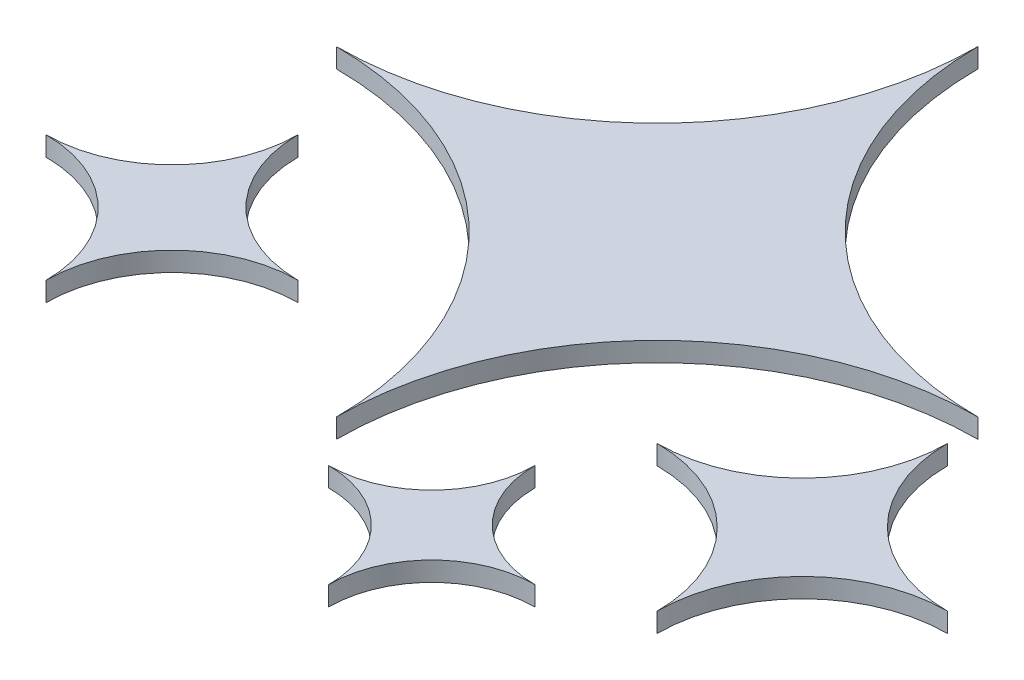
ISO-10303-21;
HEADER;
FILE_DESCRIPTION(('STEP AP214'),'2;1');
FILE_NAME('part.step','',(''),(''),'','','');
FILE_SCHEMA(('AUTOMOTIVE_DESIGN { 1 0 10303 214 1 1 1 1 }'));
ENDSEC;
DATA;
#1=APPLICATION_CONTEXT('core data for automotive mechanical design processes');
#2=APPLICATION_PROTOCOL_DEFINITION('international standard','automotive_design',2000,#1);
#3=PRODUCT_CONTEXT('',#1,'mechanical');
#4=PRODUCT('Part','Part','',(#3));
#5=PRODUCT_RELATED_PRODUCT_CATEGORY('part','',(#4));
#6=PRODUCT_DEFINITION_FORMATION('','',#4);
#7=PRODUCT_DEFINITION_CONTEXT('part definition',#1,'design');
#8=PRODUCT_DEFINITION('design','',#6,#7);
#9=PRODUCT_DEFINITION_SHAPE('','',#8);
#10=(LENGTH_UNIT() NAMED_UNIT(*) SI_UNIT(.MILLI.,.METRE.));
#11=(NAMED_UNIT(*) PLANE_ANGLE_UNIT() SI_UNIT($,.RADIAN.));
#12=(NAMED_UNIT(*) SI_UNIT($,.STERADIAN.) SOLID_ANGLE_UNIT());
#13=UNCERTAINTY_MEASURE_WITH_UNIT(LENGTH_MEASURE(1.E-05),#10,'distance_accuracy_value','');
#14=(GEOMETRIC_REPRESENTATION_CONTEXT(3) GLOBAL_UNCERTAINTY_ASSIGNED_CONTEXT((#13)) GLOBAL_UNIT_ASSIGNED_CONTEXT((#10,
#11,#12)) REPRESENTATION_CONTEXT('',''));
#15=CARTESIAN_POINT('',(0.,0.,0.));
#16=DIRECTION('',(0.,0.,1.));
#17=DIRECTION('',(1.,0.,0.));
#18=AXIS2_PLACEMENT_3D('',#15,#16,#17);
#19=CARTESIAN_POINT('',(49.0000084881791,2.54,-59.0000004293108));
#20=DIRECTION('',(0.,-1.,0.));
#21=DIRECTION('',(0.,0.,-1.));
#22=AXIS2_PLACEMENT_3D('',#19,#20,#21);
#23=CYLINDRICAL_SURFACE('',#22,16.5000025969945);
#24=CARTESIAN_POINT('',(49.0000084881791,0.,-59.0000004293108));
#25=DIRECTION('',(0.,-1.,0.));
#26=DIRECTION('',(0.,0.,1.));
#27=AXIS2_PLACEMENT_3D('',#24,#25,#26);
#28=CIRCLE('',#27,16.5000025969945);
#29=CARTESIAN_POINT('',(49.0000084881791,0.,-42.4999978323163));
#30=VERTEX_POINT('',#29);
#31=CARTESIAN_POINT('',(32.5000058911847,0.,-59.0000004293108));
#32=VERTEX_POINT('',#31);
#33=EDGE_CURVE('E12',#30,#32,#28,.T.);
#34=ORIENTED_EDGE('',*,*,#33,.T.);
#35=DIRECTION('',(0.,-1.,0.));
#36=VECTOR('',#35,1.);
#37=CARTESIAN_POINT('',(32.5000058911847,2.54,-59.0000004293108));
#38=LINE('',#37,#36);
#39=CARTESIAN_POINT('',(32.5000058911847,2.54,-59.0000004293108));
#40=VERTEX_POINT('',#39);
#41=EDGE_CURVE('E124',#40,#32,#38,.T.);
#42=ORIENTED_EDGE('',*,*,#41,.F.);
#43=CARTESIAN_POINT('',(49.0000084881791,2.54,-59.0000004293108));
#44=DIRECTION('',(0.,-1.,0.));
#45=DIRECTION('',(0.,0.,1.));
#46=AXIS2_PLACEMENT_3D('',#43,#44,#45);
#47=CIRCLE('',#46,16.5000025969945);
#48=CARTESIAN_POINT('',(49.0000084881791,2.54,-42.4999978323163));
#49=VERTEX_POINT('',#48);
#50=EDGE_CURVE('E57',#49,#40,#47,.T.);
#51=ORIENTED_EDGE('',*,*,#50,.F.);
#52=DIRECTION('',(0.,-1.,0.));
#53=VECTOR('',#52,1.);
#54=CARTESIAN_POINT('',(49.0000084881791,2.54,-42.4999978323163));
#55=LINE('',#54,#53);
#56=EDGE_CURVE('E112',#49,#30,#55,.T.);
#57=ORIENTED_EDGE('',*,*,#56,.T.);
#58=EDGE_LOOP('',(#34,#42,#51,#57));
#59=FACE_BOUND('',#58,.T.);
#60=ADVANCED_FACE('F53',(#59),#23,.F.);
#61=CARTESIAN_POINT('',(16.0000032941902,2.54,-59.0000004293108));
#62=DIRECTION('',(0.,-1.,0.));
#63=DIRECTION('',(0.,0.,-1.));
#64=AXIS2_PLACEMENT_3D('',#61,#62,#63);
#65=CYLINDRICAL_SURFACE('',#64,16.5000025969945);
#66=CARTESIAN_POINT('',(16.0000032941902,0.,-59.0000004293108));
#67=DIRECTION('',(0.,-1.,0.));
#68=DIRECTION('',(0.,0.,-1.));
#69=AXIS2_PLACEMENT_3D('',#66,#67,#68);
#70=CIRCLE('',#69,16.5000025969945);
#71=CARTESIAN_POINT('',(16.0000032941902,0.,-42.4999978323163));
#72=VERTEX_POINT('',#71);
#73=EDGE_CURVE('E63',#32,#72,#70,.T.);
#74=ORIENTED_EDGE('',*,*,#73,.T.);
#75=DIRECTION('',(0.,-1.,0.));
#76=VECTOR('',#75,1.);
#77=CARTESIAN_POINT('',(16.0000032941902,2.54,-42.4999978323163));
#78=LINE('',#77,#76);
#79=CARTESIAN_POINT('',(16.0000032941902,2.54,-42.4999978323163));
#80=VERTEX_POINT('',#79);
#81=EDGE_CURVE('E108',#80,#72,#78,.T.);
#82=ORIENTED_EDGE('',*,*,#81,.F.);
#83=CARTESIAN_POINT('',(16.0000032941902,2.54,-59.0000004293108));
#84=DIRECTION('',(0.,-1.,0.));
#85=DIRECTION('',(0.,0.,-1.));
#86=AXIS2_PLACEMENT_3D('',#83,#84,#85);
#87=CIRCLE('',#86,16.5000025969945);
#88=EDGE_CURVE('E87',#40,#80,#87,.T.);
#89=ORIENTED_EDGE('',*,*,#88,.F.);
#90=ORIENTED_EDGE('',*,*,#41,.T.);
#91=EDGE_LOOP('',(#74,#82,#89,#90));
#92=FACE_BOUND('',#91,.T.);
#93=ADVANCED_FACE('F127',(#92),#65,.F.);
#94=CARTESIAN_POINT('',(16.0000032941902,2.54,-25.9999952353219));
#95=DIRECTION('',(0.,-1.,0.));
#96=DIRECTION('',(0.,0.,-1.));
#97=AXIS2_PLACEMENT_3D('',#94,#95,#96);
#98=CYLINDRICAL_SURFACE('',#97,16.5000025969944);
#99=CARTESIAN_POINT('',(16.0000032941902,0.,-25.9999952353219));
#100=DIRECTION('',(0.,-1.,0.));
#101=DIRECTION('',(0.,0.,1.));
#102=AXIS2_PLACEMENT_3D('',#99,#100,#101);
#103=CIRCLE('',#102,16.5000025969944);
#104=CARTESIAN_POINT('',(32.5000058911847,0.,-25.9999952353219));
#105=VERTEX_POINT('',#104);
#106=EDGE_CURVE('E103',#72,#105,#103,.T.);
#107=ORIENTED_EDGE('',*,*,#106,.T.);
#108=DIRECTION('',(0.,-1.,0.));
#109=VECTOR('',#108,1.);
#110=CARTESIAN_POINT('',(32.5000058911847,2.54,-25.9999952353219));
#111=LINE('',#110,#109);
#112=CARTESIAN_POINT('',(32.5000058911847,2.54,-25.9999952353219));
#113=VERTEX_POINT('',#112);
#114=EDGE_CURVE('E106',#113,#105,#111,.T.);
#115=ORIENTED_EDGE('',*,*,#114,.F.);
#116=CARTESIAN_POINT('',(16.0000032941902,2.54,-25.9999952353219));
#117=DIRECTION('',(0.,-1.,0.));
#118=DIRECTION('',(0.,0.,1.));
#119=AXIS2_PLACEMENT_3D('',#116,#117,#118);
#120=CIRCLE('',#119,16.5000025969944);
#121=EDGE_CURVE('E120',#80,#113,#120,.T.);
#122=ORIENTED_EDGE('',*,*,#121,.F.);
#123=ORIENTED_EDGE('',*,*,#81,.T.);
#124=EDGE_LOOP('',(#107,#115,#122,#123));
#125=FACE_BOUND('',#124,.T.);
#126=ADVANCED_FACE('F104',(#125),#98,.F.);
#127=CARTESIAN_POINT('',(49.0000084881791,2.54,-25.9999952353219));
#128=DIRECTION('',(0.,-1.,0.));
#129=DIRECTION('',(0.,0.,-1.));
#130=AXIS2_PLACEMENT_3D('',#127,#128,#129);
#131=CYLINDRICAL_SURFACE('',#130,16.5000025969945);
#132=CARTESIAN_POINT('',(49.0000084881791,0.,-25.9999952353219));
#133=DIRECTION('',(0.,-1.,0.));
#134=DIRECTION('',(0.,0.,-1.));
#135=AXIS2_PLACEMENT_3D('',#132,#133,#134);
#136=CIRCLE('',#135,16.5000025969945);
#137=EDGE_CURVE('E97',#105,#30,#136,.T.);
#138=ORIENTED_EDGE('',*,*,#137,.T.);
#139=ORIENTED_EDGE('',*,*,#56,.F.);
#140=CARTESIAN_POINT('',(49.0000084881791,2.54,-25.9999952353219));
#141=DIRECTION('',(0.,-1.,0.));
#142=DIRECTION('',(0.,0.,-1.));
#143=AXIS2_PLACEMENT_3D('',#140,#141,#142);
#144=CIRCLE('',#143,16.5000025969945);
#145=EDGE_CURVE('E111',#113,#49,#144,.T.);
#146=ORIENTED_EDGE('',*,*,#145,.F.);
#147=ORIENTED_EDGE('',*,*,#114,.T.);
#148=EDGE_LOOP('',(#138,#139,#146,#147));
#149=FACE_BOUND('',#148,.T.);
#150=ADVANCED_FACE('F110',(#149),#131,.F.);
#151=CARTESIAN_POINT('',(49.0000084881791,2.54,-42.4999978323163));
#152=DIRECTION('',(0.,1.,0.));
#153=DIRECTION('',(0.,0.,1.));
#154=AXIS2_PLACEMENT_3D('',#151,#152,#153);
#155=PLANE('',#154);
#156=ORIENTED_EDGE('',*,*,#50,.T.);
#157=ORIENTED_EDGE('',*,*,#88,.T.);
#158=ORIENTED_EDGE('',*,*,#121,.T.);
#159=ORIENTED_EDGE('',*,*,#145,.T.);
#160=EDGE_LOOP('',(#156,#157,#158,#159));
#161=FACE_BOUND('',#160,.T.);
#162=ADVANCED_FACE('F55',(#161),#155,.T.);
#163=CARTESIAN_POINT('',(49.0000084881791,0.,-42.4999978323163));
#164=DIRECTION('',(0.,1.,0.));
#165=DIRECTION('',(0.,0.,1.));
#166=AXIS2_PLACEMENT_3D('',#163,#164,#165);
#167=PLANE('',#166);
#168=ORIENTED_EDGE('',*,*,#33,.F.);
#169=ORIENTED_EDGE('',*,*,#137,.F.);
#170=ORIENTED_EDGE('',*,*,#106,.F.);
#171=ORIENTED_EDGE('',*,*,#73,.F.);
#172=EDGE_LOOP('',(#168,#169,#170,#171));
#173=FACE_BOUND('',#172,.T.);
#174=ADVANCED_FACE('F114',(#173),#167,.F.);
#175=CLOSED_SHELL('',(#60,#93,#126,#150,#162,#174));
#176=MANIFOLD_SOLID_BREP('B2',#175);
#177=CARTESIAN_POINT('',(99.000008693278,2.54,-37.0000076373067));
#178=DIRECTION('',(0.,-1.,0.));
#179=DIRECTION('',(0.,0.,-1.));
#180=AXIS2_PLACEMENT_3D('',#177,#178,#179);
#181=CYLINDRICAL_SURFACE('',#180,13.50000653279);
#182=CARTESIAN_POINT('',(99.000008693278,0.,-37.0000076373067));
#183=DIRECTION('',(0.,-1.,0.));
#184=DIRECTION('',(0.,0.,1.));
#185=AXIS2_PLACEMENT_3D('',#182,#183,#184);
#186=CIRCLE('',#185,13.50000653279);
#187=CARTESIAN_POINT('',(99.000008693278,0.,-23.5000011045167));
#188=VERTEX_POINT('',#187);
#189=CARTESIAN_POINT('',(85.5000021604879,0.,-37.0000076373067));
#190=VERTEX_POINT('',#189);
#191=EDGE_CURVE('E51',#188,#190,#186,.T.);
#192=ORIENTED_EDGE('',*,*,#191,.T.);
#193=DIRECTION('',(0.,-1.,0.));
#194=VECTOR('',#193,1.);
#195=CARTESIAN_POINT('',(85.5000021604879,2.54,-37.0000076373067));
#196=LINE('',#195,#194);
#197=CARTESIAN_POINT('',(85.5000021604879,2.54,-37.0000076373067));
#198=VERTEX_POINT('',#197);
#199=EDGE_CURVE('E269',#198,#190,#196,.T.);
#200=ORIENTED_EDGE('',*,*,#199,.F.);
#201=CARTESIAN_POINT('',(99.000008693278,2.54,-37.0000076373067));
#202=DIRECTION('',(0.,-1.,0.));
#203=DIRECTION('',(0.,0.,1.));
#204=AXIS2_PLACEMENT_3D('',#201,#202,#203);
#205=CIRCLE('',#204,13.50000653279);
#206=CARTESIAN_POINT('',(99.000008693278,2.54,-23.5000011045167));
#207=VERTEX_POINT('',#206);
#208=EDGE_CURVE('E202',#207,#198,#205,.T.);
#209=ORIENTED_EDGE('',*,*,#208,.F.);
#210=DIRECTION('',(0.,-1.,0.));
#211=VECTOR('',#210,1.);
#212=CARTESIAN_POINT('',(99.000008693278,2.54,-23.5000011045167));
#213=LINE('',#212,#211);
#214=EDGE_CURVE('E257',#207,#188,#213,.T.);
#215=ORIENTED_EDGE('',*,*,#214,.T.);
#216=EDGE_LOOP('',(#192,#200,#209,#215));
#217=FACE_BOUND('',#216,.T.);
#218=ADVANCED_FACE('F198',(#217),#181,.F.);
#219=CARTESIAN_POINT('',(71.9999956276979,2.54,-37.0000076373067));
#220=DIRECTION('',(0.,-1.,0.));
#221=DIRECTION('',(0.,0.,-1.));
#222=AXIS2_PLACEMENT_3D('',#219,#220,#221);
#223=CYLINDRICAL_SURFACE('',#222,13.50000653279);
#224=CARTESIAN_POINT('',(71.9999956276979,0.,-37.0000076373067));
#225=DIRECTION('',(0.,-1.,0.));
#226=DIRECTION('',(0.,0.,-1.));
#227=AXIS2_PLACEMENT_3D('',#224,#225,#226);
#228=CIRCLE('',#227,13.50000653279);
#229=CARTESIAN_POINT('',(71.9999956276979,0.,-23.5000011045167));
#230=VERTEX_POINT('',#229);
#231=EDGE_CURVE('E208',#190,#230,#228,.T.);
#232=ORIENTED_EDGE('',*,*,#231,.T.);
#233=DIRECTION('',(0.,-1.,0.));
#234=VECTOR('',#233,1.);
#235=CARTESIAN_POINT('',(71.9999956276979,2.54,-23.5000011045167));
#236=LINE('',#235,#234);
#237=CARTESIAN_POINT('',(71.9999956276979,2.54,-23.5000011045167));
#238=VERTEX_POINT('',#237);
#239=EDGE_CURVE('E253',#238,#230,#236,.T.);
#240=ORIENTED_EDGE('',*,*,#239,.F.);
#241=CARTESIAN_POINT('',(71.9999956276979,2.54,-37.0000076373067));
#242=DIRECTION('',(0.,-1.,0.));
#243=DIRECTION('',(0.,0.,-1.));
#244=AXIS2_PLACEMENT_3D('',#241,#242,#243);
#245=CIRCLE('',#244,13.50000653279);
#246=EDGE_CURVE('E232',#198,#238,#245,.T.);
#247=ORIENTED_EDGE('',*,*,#246,.F.);
#248=ORIENTED_EDGE('',*,*,#199,.T.);
#249=EDGE_LOOP('',(#232,#240,#247,#248));
#250=FACE_BOUND('',#249,.T.);
#251=ADVANCED_FACE('F272',(#250),#223,.F.);
#252=CARTESIAN_POINT('',(71.9999956276979,2.54,-9.99999457172668));
#253=DIRECTION('',(0.,-1.,0.));
#254=DIRECTION('',(0.,0.,-1.));
#255=AXIS2_PLACEMENT_3D('',#252,#253,#254);
#256=CYLINDRICAL_SURFACE('',#255,13.50000653279);
#257=CARTESIAN_POINT('',(71.9999956276979,0.,-9.99999457172668));
#258=DIRECTION('',(0.,-1.,0.));
#259=DIRECTION('',(0.,0.,1.));
#260=AXIS2_PLACEMENT_3D('',#257,#258,#259);
#261=CIRCLE('',#260,13.50000653279);
#262=CARTESIAN_POINT('',(85.5000021604879,0.,-9.99999457172665));
#263=VERTEX_POINT('',#262);
#264=EDGE_CURVE('E248',#230,#263,#261,.T.);
#265=ORIENTED_EDGE('',*,*,#264,.T.);
#266=DIRECTION('',(0.,-1.,0.));
#267=VECTOR('',#266,1.);
#268=CARTESIAN_POINT('',(85.5000021604879,2.54,-9.99999457172665));
#269=LINE('',#268,#267);
#270=CARTESIAN_POINT('',(85.5000021604879,2.54,-9.99999457172665));
#271=VERTEX_POINT('',#270);
#272=EDGE_CURVE('E251',#271,#263,#269,.T.);
#273=ORIENTED_EDGE('',*,*,#272,.F.);
#274=CARTESIAN_POINT('',(71.9999956276979,2.54,-9.99999457172668));
#275=DIRECTION('',(0.,-1.,0.));
#276=DIRECTION('',(0.,0.,1.));
#277=AXIS2_PLACEMENT_3D('',#274,#275,#276);
#278=CIRCLE('',#277,13.50000653279);
#279=EDGE_CURVE('E265',#238,#271,#278,.T.);
#280=ORIENTED_EDGE('',*,*,#279,.F.);
#281=ORIENTED_EDGE('',*,*,#239,.T.);
#282=EDGE_LOOP('',(#265,#273,#280,#281));
#283=FACE_BOUND('',#282,.T.);
#284=ADVANCED_FACE('F249',(#283),#256,.F.);
#285=CARTESIAN_POINT('',(99.000008693278,2.54,-9.99999457172665));
#286=DIRECTION('',(0.,-1.,0.));
#287=DIRECTION('',(0.,0.,-1.));
#288=AXIS2_PLACEMENT_3D('',#285,#286,#287);
#289=CYLINDRICAL_SURFACE('',#288,13.50000653279);
#290=CARTESIAN_POINT('',(99.000008693278,0.,-9.99999457172665));
#291=DIRECTION('',(0.,-1.,0.));
#292=DIRECTION('',(0.,0.,-1.));
#293=AXIS2_PLACEMENT_3D('',#290,#291,#292);
#294=CIRCLE('',#293,13.50000653279);
#295=EDGE_CURVE('E242',#263,#188,#294,.T.);
#296=ORIENTED_EDGE('',*,*,#295,.T.);
#297=ORIENTED_EDGE('',*,*,#214,.F.);
#298=CARTESIAN_POINT('',(99.000008693278,2.54,-9.99999457172665));
#299=DIRECTION('',(0.,-1.,0.));
#300=DIRECTION('',(0.,0.,-1.));
#301=AXIS2_PLACEMENT_3D('',#298,#299,#300);
#302=CIRCLE('',#301,13.50000653279);
#303=EDGE_CURVE('E256',#271,#207,#302,.T.);
#304=ORIENTED_EDGE('',*,*,#303,.F.);
#305=ORIENTED_EDGE('',*,*,#272,.T.);
#306=EDGE_LOOP('',(#296,#297,#304,#305));
#307=FACE_BOUND('',#306,.T.);
#308=ADVANCED_FACE('F255',(#307),#289,.F.);
#309=CARTESIAN_POINT('',(99.000008693278,2.54,-23.5000011045167));
#310=DIRECTION('',(0.,1.,0.));
#311=DIRECTION('',(0.,0.,1.));
#312=AXIS2_PLACEMENT_3D('',#309,#310,#311);
#313=PLANE('',#312);
#314=ORIENTED_EDGE('',*,*,#208,.T.);
#315=ORIENTED_EDGE('',*,*,#246,.T.);
#316=ORIENTED_EDGE('',*,*,#279,.T.);
#317=ORIENTED_EDGE('',*,*,#303,.T.);
#318=EDGE_LOOP('',(#314,#315,#316,#317));
#319=FACE_BOUND('',#318,.T.);
#320=ADVANCED_FACE('F200',(#319),#313,.T.);
#321=CARTESIAN_POINT('',(99.000008693278,0.,-23.5000011045167));
#322=DIRECTION('',(0.,1.,0.));
#323=DIRECTION('',(0.,0.,1.));
#324=AXIS2_PLACEMENT_3D('',#321,#322,#323);
#325=PLANE('',#324);
#326=ORIENTED_EDGE('',*,*,#191,.F.);
#327=ORIENTED_EDGE('',*,*,#295,.F.);
#328=ORIENTED_EDGE('',*,*,#264,.F.);
#329=ORIENTED_EDGE('',*,*,#231,.F.);
#330=EDGE_LOOP('',(#326,#327,#328,#329));
#331=FACE_BOUND('',#330,.T.);
#332=ADVANCED_FACE('F259',(#331),#325,.F.);
#333=CLOSED_SHELL('',(#218,#251,#284,#308,#320,#332));
#334=MANIFOLD_SOLID_BREP('B6',#333);
#335=CARTESIAN_POINT('',(129.000016704429,2.54,-66.500014723013));
#336=DIRECTION('',(0.,-1.,0.));
#337=DIRECTION('',(0.,0.,-1.));
#338=AXIS2_PLACEMENT_3D('',#335,#336,#337);
#339=CYLINDRICAL_SURFACE('',#338,19.0000095513192);
#340=CARTESIAN_POINT('',(129.000016704429,0.,-66.500014723013));
#341=DIRECTION('',(0.,-1.,0.));
#342=DIRECTION('',(0.,0.,1.));
#343=AXIS2_PLACEMENT_3D('',#340,#341,#342);
#344=CIRCLE('',#343,19.0000095513192);
#345=CARTESIAN_POINT('',(129.000016704429,0.,-47.5000051716939));
#346=VERTEX_POINT('',#345);
#347=CARTESIAN_POINT('',(110.000007153109,0.,-66.500014723013));
#348=VERTEX_POINT('',#347);
#349=EDGE_CURVE('E196',#346,#348,#344,.T.);
#350=ORIENTED_EDGE('',*,*,#349,.T.);
#351=DIRECTION('',(0.,-1.,0.));
#352=VECTOR('',#351,1.);
#353=CARTESIAN_POINT('',(110.000007153109,2.54,-66.500014723013));
#354=LINE('',#353,#352);
#355=CARTESIAN_POINT('',(110.000007153109,2.54,-66.500014723013));
#356=VERTEX_POINT('',#355);
#357=EDGE_CURVE('E413',#356,#348,#354,.T.);
#358=ORIENTED_EDGE('',*,*,#357,.F.);
#359=CARTESIAN_POINT('',(129.000016704429,2.54,-66.500014723013));
#360=DIRECTION('',(0.,-1.,0.));
#361=DIRECTION('',(0.,0.,1.));
#362=AXIS2_PLACEMENT_3D('',#359,#360,#361);
#363=CIRCLE('',#362,19.0000095513192);
#364=CARTESIAN_POINT('',(129.000016704429,2.54,-47.5000051716939));
#365=VERTEX_POINT('',#364);
#366=EDGE_CURVE('E346',#365,#356,#363,.T.);
#367=ORIENTED_EDGE('',*,*,#366,.F.);
#368=DIRECTION('',(0.,-1.,0.));
#369=VECTOR('',#368,1.);
#370=CARTESIAN_POINT('',(129.000016704429,2.54,-47.5000051716939));
#371=LINE('',#370,#369);
#372=EDGE_CURVE('E401',#365,#346,#371,.T.);
#373=ORIENTED_EDGE('',*,*,#372,.T.);
#374=EDGE_LOOP('',(#350,#358,#367,#373));
#375=FACE_BOUND('',#374,.T.);
#376=ADVANCED_FACE('F342',(#375),#339,.F.);
#377=CARTESIAN_POINT('',(90.9999976017903,2.54,-66.500014723013));
#378=DIRECTION('',(0.,-1.,0.));
#379=DIRECTION('',(0.,0.,-1.));
#380=AXIS2_PLACEMENT_3D('',#377,#378,#379);
#381=CYLINDRICAL_SURFACE('',#380,19.0000095513192);
#382=CARTESIAN_POINT('',(90.9999976017903,0.,-66.500014723013));
#383=DIRECTION('',(0.,-1.,0.));
#384=DIRECTION('',(0.,0.,-1.));
#385=AXIS2_PLACEMENT_3D('',#382,#383,#384);
#386=CIRCLE('',#385,19.0000095513192);
#387=CARTESIAN_POINT('',(90.9999976017903,0.,-47.5000051716939));
#388=VERTEX_POINT('',#387);
#389=EDGE_CURVE('E352',#348,#388,#386,.T.);
#390=ORIENTED_EDGE('',*,*,#389,.T.);
#391=DIRECTION('',(0.,-1.,0.));
#392=VECTOR('',#391,1.);
#393=CARTESIAN_POINT('',(90.9999976017903,2.54,-47.5000051716939));
#394=LINE('',#393,#392);
#395=CARTESIAN_POINT('',(90.9999976017903,2.54,-47.5000051716939));
#396=VERTEX_POINT('',#395);
#397=EDGE_CURVE('E397',#396,#388,#394,.T.);
#398=ORIENTED_EDGE('',*,*,#397,.F.);
#399=CARTESIAN_POINT('',(90.9999976017903,2.54,-66.500014723013));
#400=DIRECTION('',(0.,-1.,0.));
#401=DIRECTION('',(0.,0.,-1.));
#402=AXIS2_PLACEMENT_3D('',#399,#400,#401);
#403=CIRCLE('',#402,19.0000095513192);
#404=EDGE_CURVE('E376',#356,#396,#403,.T.);
#405=ORIENTED_EDGE('',*,*,#404,.F.);
#406=ORIENTED_EDGE('',*,*,#357,.T.);
#407=EDGE_LOOP('',(#390,#398,#405,#406));
#408=FACE_BOUND('',#407,.T.);
#409=ADVANCED_FACE('F416',(#408),#381,.F.);
#410=CARTESIAN_POINT('',(90.9999976017903,2.54,-28.4999956203747));
#411=DIRECTION('',(0.,-1.,0.));
#412=DIRECTION('',(0.,0.,-1.));
#413=AXIS2_PLACEMENT_3D('',#410,#411,#412);
#414=CYLINDRICAL_SURFACE('',#413,19.0000095513192);
#415=CARTESIAN_POINT('',(90.9999976017903,0.,-28.4999956203747));
#416=DIRECTION('',(0.,-1.,0.));
#417=DIRECTION('',(0.,0.,1.));
#418=AXIS2_PLACEMENT_3D('',#415,#416,#417);
#419=CIRCLE('',#418,19.0000095513192);
#420=CARTESIAN_POINT('',(110.000007153109,0.,-28.4999956203747));
#421=VERTEX_POINT('',#420);
#422=EDGE_CURVE('E392',#388,#421,#419,.T.);
#423=ORIENTED_EDGE('',*,*,#422,.T.);
#424=DIRECTION('',(0.,-1.,0.));
#425=VECTOR('',#424,1.);
#426=CARTESIAN_POINT('',(110.000007153109,2.54,-28.4999956203747));
#427=LINE('',#426,#425);
#428=CARTESIAN_POINT('',(110.000007153109,2.54,-28.4999956203747));
#429=VERTEX_POINT('',#428);
#430=EDGE_CURVE('E395',#429,#421,#427,.T.);
#431=ORIENTED_EDGE('',*,*,#430,.F.);
#432=CARTESIAN_POINT('',(90.9999976017903,2.54,-28.4999956203747));
#433=DIRECTION('',(0.,-1.,0.));
#434=DIRECTION('',(0.,0.,1.));
#435=AXIS2_PLACEMENT_3D('',#432,#433,#434);
#436=CIRCLE('',#435,19.0000095513192);
#437=EDGE_CURVE('E409',#396,#429,#436,.T.);
#438=ORIENTED_EDGE('',*,*,#437,.F.);
#439=ORIENTED_EDGE('',*,*,#397,.T.);
#440=EDGE_LOOP('',(#423,#431,#438,#439));
#441=FACE_BOUND('',#440,.T.);
#442=ADVANCED_FACE('F393',(#441),#414,.F.);
#443=CARTESIAN_POINT('',(129.000016704429,2.54,-28.4999956203747));
#444=DIRECTION('',(0.,-1.,0.));
#445=DIRECTION('',(0.,0.,-1.));
#446=AXIS2_PLACEMENT_3D('',#443,#444,#445);
#447=CYLINDRICAL_SURFACE('',#446,19.0000095513191);
#448=CARTESIAN_POINT('',(129.000016704429,0.,-28.4999956203747));
#449=DIRECTION('',(0.,-1.,0.));
#450=DIRECTION('',(0.,0.,-1.));
#451=AXIS2_PLACEMENT_3D('',#448,#449,#450);
#452=CIRCLE('',#451,19.0000095513191);
#453=EDGE_CURVE('E386',#421,#346,#452,.T.);
#454=ORIENTED_EDGE('',*,*,#453,.T.);
#455=ORIENTED_EDGE('',*,*,#372,.F.);
#456=CARTESIAN_POINT('',(129.000016704429,2.54,-28.4999956203747));
#457=DIRECTION('',(0.,-1.,0.));
#458=DIRECTION('',(0.,0.,-1.));
#459=AXIS2_PLACEMENT_3D('',#456,#457,#458);
#460=CIRCLE('',#459,19.0000095513191);
#461=EDGE_CURVE('E400',#429,#365,#460,.T.);
#462=ORIENTED_EDGE('',*,*,#461,.F.);
#463=ORIENTED_EDGE('',*,*,#430,.T.);
#464=EDGE_LOOP('',(#454,#455,#462,#463));
#465=FACE_BOUND('',#464,.T.);
#466=ADVANCED_FACE('F399',(#465),#447,.F.);
#467=CARTESIAN_POINT('',(129.000016704429,2.54,-47.5000051716939));
#468=DIRECTION('',(0.,1.,0.));
#469=DIRECTION('',(0.,0.,1.));
#470=AXIS2_PLACEMENT_3D('',#467,#468,#469);
#471=PLANE('',#470);
#472=ORIENTED_EDGE('',*,*,#366,.T.);
#473=ORIENTED_EDGE('',*,*,#404,.T.);
#474=ORIENTED_EDGE('',*,*,#437,.T.);
#475=ORIENTED_EDGE('',*,*,#461,.T.);
#476=EDGE_LOOP('',(#472,#473,#474,#475));
#477=FACE_BOUND('',#476,.T.);
#478=ADVANCED_FACE('F344',(#477),#471,.T.);
#479=CARTESIAN_POINT('',(129.000016704429,0.,-47.5000051716939));
#480=DIRECTION('',(0.,1.,0.));
#481=DIRECTION('',(0.,0.,1.));
#482=AXIS2_PLACEMENT_3D('',#479,#480,#481);
#483=PLANE('',#482);
#484=ORIENTED_EDGE('',*,*,#349,.F.);
#485=ORIENTED_EDGE('',*,*,#453,.F.);
#486=ORIENTED_EDGE('',*,*,#422,.F.);
#487=ORIENTED_EDGE('',*,*,#389,.F.);
#488=EDGE_LOOP('',(#484,#485,#486,#487));
#489=FACE_BOUND('',#488,.T.);
#490=ADVANCED_FACE('F403',(#489),#483,.F.);
#491=CLOSED_SHELL('',(#376,#409,#442,#466,#478,#490));
#492=MANIFOLD_SOLID_BREP('B45',#491);
#493=CARTESIAN_POINT('',(109.000011910975,2.54,-113.499997606531));
#494=DIRECTION('',(0.,-1.,0.));
#495=DIRECTION('',(0.,0.,-1.));
#496=AXIS2_PLACEMENT_3D('',#493,#494,#495);
#497=CYLINDRICAL_SURFACE('',#496,42.0000033720106);
#498=CARTESIAN_POINT('',(109.000011910975,0.,-113.499997606531));
#499=DIRECTION('',(0.,-1.,0.));
#500=DIRECTION('',(0.,0.,1.));
#501=AXIS2_PLACEMENT_3D('',#498,#499,#500);
#502=CIRCLE('',#501,42.0000033720106);
#503=CARTESIAN_POINT('',(109.000011910975,0.,-71.4999942345201));
#504=VERTEX_POINT('',#503);
#505=CARTESIAN_POINT('',(67.0000085389641,0.,-113.499997606531));
#506=VERTEX_POINT('',#505);
#507=EDGE_CURVE('E545',#504,#506,#502,.T.);
#508=ORIENTED_EDGE('',*,*,#507,.T.);
#509=DIRECTION('',(0.,-1.,0.));
#510=VECTOR('',#509,1.);
#511=CARTESIAN_POINT('',(67.0000085389641,2.54,-113.499997606531));
#512=LINE('',#511,#510);
#513=CARTESIAN_POINT('',(67.0000085389641,2.54,-113.499997606531));
#514=VERTEX_POINT('',#513);
#515=EDGE_CURVE('E340',#514,#506,#512,.T.);
#516=ORIENTED_EDGE('',*,*,#515,.F.);
#517=CARTESIAN_POINT('',(109.000011910975,2.54,-113.499997606531));
#518=DIRECTION('',(0.,-1.,0.));
#519=DIRECTION('',(0.,0.,1.));
#520=AXIS2_PLACEMENT_3D('',#517,#518,#519);
#521=CIRCLE('',#520,42.0000033720106);
#522=CARTESIAN_POINT('',(109.000011910975,2.54,-71.4999942345201));
#523=VERTEX_POINT('',#522);
#524=EDGE_CURVE('E529',#523,#514,#521,.T.);
#525=ORIENTED_EDGE('',*,*,#524,.F.);
#526=DIRECTION('',(0.,-1.,0.));
#527=VECTOR('',#526,1.);
#528=CARTESIAN_POINT('',(109.000011910975,2.54,-71.4999942345201));
#529=LINE('',#528,#527);
#530=EDGE_CURVE('E541',#523,#504,#529,.T.);
#531=ORIENTED_EDGE('',*,*,#530,.T.);
#532=EDGE_LOOP('',(#508,#516,#525,#531));
#533=FACE_BOUND('',#532,.T.);
#534=ADVANCED_FACE('F477',(#533),#497,.F.);
#535=CARTESIAN_POINT('',(25.0000051669535,2.54,-113.499997606531));
#536=DIRECTION('',(0.,-1.,0.));
#537=DIRECTION('',(0.,0.,-1.));
#538=AXIS2_PLACEMENT_3D('',#535,#536,#537);
#539=CYLINDRICAL_SURFACE('',#538,42.0000033720106);
#540=CARTESIAN_POINT('',(25.0000051669535,0.,-113.499997606531));
#541=DIRECTION('',(0.,-1.,0.));
#542=DIRECTION('',(0.,0.,-1.));
#543=AXIS2_PLACEMENT_3D('',#540,#541,#542);
#544=CIRCLE('',#543,42.0000033720106);
#545=CARTESIAN_POINT('',(25.0000051669535,0.,-71.4999942345201));
#546=VERTEX_POINT('',#545);
#547=EDGE_CURVE('E534',#506,#546,#544,.T.);
#548=ORIENTED_EDGE('',*,*,#547,.T.);
#549=DIRECTION('',(0.,-1.,0.));
#550=VECTOR('',#549,1.);
#551=CARTESIAN_POINT('',(25.0000051669535,2.54,-71.4999942345201));
#552=LINE('',#551,#550);
#553=CARTESIAN_POINT('',(25.0000051669535,2.54,-71.4999942345201));
#554=VERTEX_POINT('',#553);
#555=EDGE_CURVE('E486',#554,#546,#552,.T.);
#556=ORIENTED_EDGE('',*,*,#555,.F.);
#557=CARTESIAN_POINT('',(25.0000051669535,2.54,-113.499997606531));
#558=DIRECTION('',(0.,-1.,0.));
#559=DIRECTION('',(0.,0.,-1.));
#560=AXIS2_PLACEMENT_3D('',#557,#558,#559);
#561=CIRCLE('',#560,42.0000033720106);
#562=EDGE_CURVE('E524',#514,#554,#561,.T.);
#563=ORIENTED_EDGE('',*,*,#562,.F.);
#564=ORIENTED_EDGE('',*,*,#515,.T.);
#565=EDGE_LOOP('',(#548,#556,#563,#564));
#566=FACE_BOUND('',#565,.T.);
#567=ADVANCED_FACE('F533',(#566),#539,.F.);
#568=CARTESIAN_POINT('',(25.0000051669535,2.54,-29.4999908625095));
#569=DIRECTION('',(0.,-1.,0.));
#570=DIRECTION('',(0.,0.,-1.));
#571=AXIS2_PLACEMENT_3D('',#568,#569,#570);
#572=CYLINDRICAL_SURFACE('',#571,42.0000033720106);
#573=CARTESIAN_POINT('',(25.0000051669535,0.,-29.4999908625095));
#574=DIRECTION('',(0.,-1.,0.));
#575=DIRECTION('',(0.,0.,1.));
#576=AXIS2_PLACEMENT_3D('',#573,#574,#575);
#577=CIRCLE('',#576,42.0000033720106);
#578=CARTESIAN_POINT('',(67.0000085389641,0.,-29.4999908625095));
#579=VERTEX_POINT('',#578);
#580=EDGE_CURVE('E511',#546,#579,#577,.T.);
#581=ORIENTED_EDGE('',*,*,#580,.T.);
#582=DIRECTION('',(0.,-1.,0.));
#583=VECTOR('',#582,1.);
#584=CARTESIAN_POINT('',(67.0000085389641,2.54,-29.4999908625095));
#585=LINE('',#584,#583);
#586=CARTESIAN_POINT('',(67.0000085389641,2.54,-29.4999908625095));
#587=VERTEX_POINT('',#586);
#588=EDGE_CURVE('E536',#587,#579,#585,.T.);
#589=ORIENTED_EDGE('',*,*,#588,.F.);
#590=CARTESIAN_POINT('',(25.0000051669535,2.54,-29.4999908625095));
#591=DIRECTION('',(0.,-1.,0.));
#592=DIRECTION('',(0.,0.,1.));
#593=AXIS2_PLACEMENT_3D('',#590,#591,#592);
#594=CIRCLE('',#593,42.0000033720106);
#595=EDGE_CURVE('E527',#554,#587,#594,.T.);
#596=ORIENTED_EDGE('',*,*,#595,.F.);
#597=ORIENTED_EDGE('',*,*,#555,.T.);
#598=EDGE_LOOP('',(#581,#589,#596,#597));
#599=FACE_BOUND('',#598,.T.);
#600=ADVANCED_FACE('F537',(#599),#572,.F.);
#601=CARTESIAN_POINT('',(109.000011910975,2.54,-29.4999908625095));
#602=DIRECTION('',(0.,-1.,0.));
#603=DIRECTION('',(0.,0.,-1.));
#604=AXIS2_PLACEMENT_3D('',#601,#602,#603);
#605=CYLINDRICAL_SURFACE('',#604,42.0000033720105);
#606=CARTESIAN_POINT('',(109.000011910975,0.,-29.4999908625095));
#607=DIRECTION('',(0.,-1.,0.));
#608=DIRECTION('',(0.,0.,-1.));
#609=AXIS2_PLACEMENT_3D('',#606,#607,#608);
#610=CIRCLE('',#609,42.0000033720105);
#611=EDGE_CURVE('E517',#579,#504,#610,.T.);
#612=ORIENTED_EDGE('',*,*,#611,.T.);
#613=ORIENTED_EDGE('',*,*,#530,.F.);
#614=CARTESIAN_POINT('',(109.000011910975,2.54,-29.4999908625095));
#615=DIRECTION('',(0.,-1.,0.));
#616=DIRECTION('',(0.,0.,-1.));
#617=AXIS2_PLACEMENT_3D('',#614,#615,#616);
#618=CIRCLE('',#617,42.0000033720105);
#619=EDGE_CURVE('E494',#587,#523,#618,.T.);
#620=ORIENTED_EDGE('',*,*,#619,.F.);
#621=ORIENTED_EDGE('',*,*,#588,.T.);
#622=EDGE_LOOP('',(#612,#613,#620,#621));
#623=FACE_BOUND('',#622,.T.);
#624=ADVANCED_FACE('F558',(#623),#605,.F.);
#625=CARTESIAN_POINT('',(109.000011910975,2.54,-71.4999942345201));
#626=DIRECTION('',(0.,1.,0.));
#627=DIRECTION('',(0.,0.,1.));
#628=AXIS2_PLACEMENT_3D('',#625,#626,#627);
#629=PLANE('',#628);
#630=ORIENTED_EDGE('',*,*,#524,.T.);
#631=ORIENTED_EDGE('',*,*,#562,.T.);
#632=ORIENTED_EDGE('',*,*,#595,.T.);
#633=ORIENTED_EDGE('',*,*,#619,.T.);
#634=EDGE_LOOP('',(#630,#631,#632,#633));
#635=FACE_BOUND('',#634,.T.);
#636=ADVANCED_FACE('F525',(#635),#629,.T.);
#637=CARTESIAN_POINT('',(109.000011910975,0.,-71.4999942345201));
#638=DIRECTION('',(0.,1.,0.));
#639=DIRECTION('',(0.,0.,1.));
#640=AXIS2_PLACEMENT_3D('',#637,#638,#639);
#641=PLANE('',#640);
#642=ORIENTED_EDGE('',*,*,#507,.F.);
#643=ORIENTED_EDGE('',*,*,#611,.F.);
#644=ORIENTED_EDGE('',*,*,#580,.F.);
#645=ORIENTED_EDGE('',*,*,#547,.F.);
#646=EDGE_LOOP('',(#642,#643,#644,#645));
#647=FACE_BOUND('',#646,.T.);
#648=ADVANCED_FACE('F561',(#647),#641,.F.);
#649=CLOSED_SHELL('',(#534,#567,#600,#624,#636,#648));
#650=MANIFOLD_SOLID_BREP('B190',#649);
#651=ADVANCED_BREP_SHAPE_REPRESENTATION('',(#18,#176,#334,#492,#650),#14);
#652=SHAPE_DEFINITION_REPRESENTATION(#9,#651);
ENDSEC;
END-ISO-10303-21;
